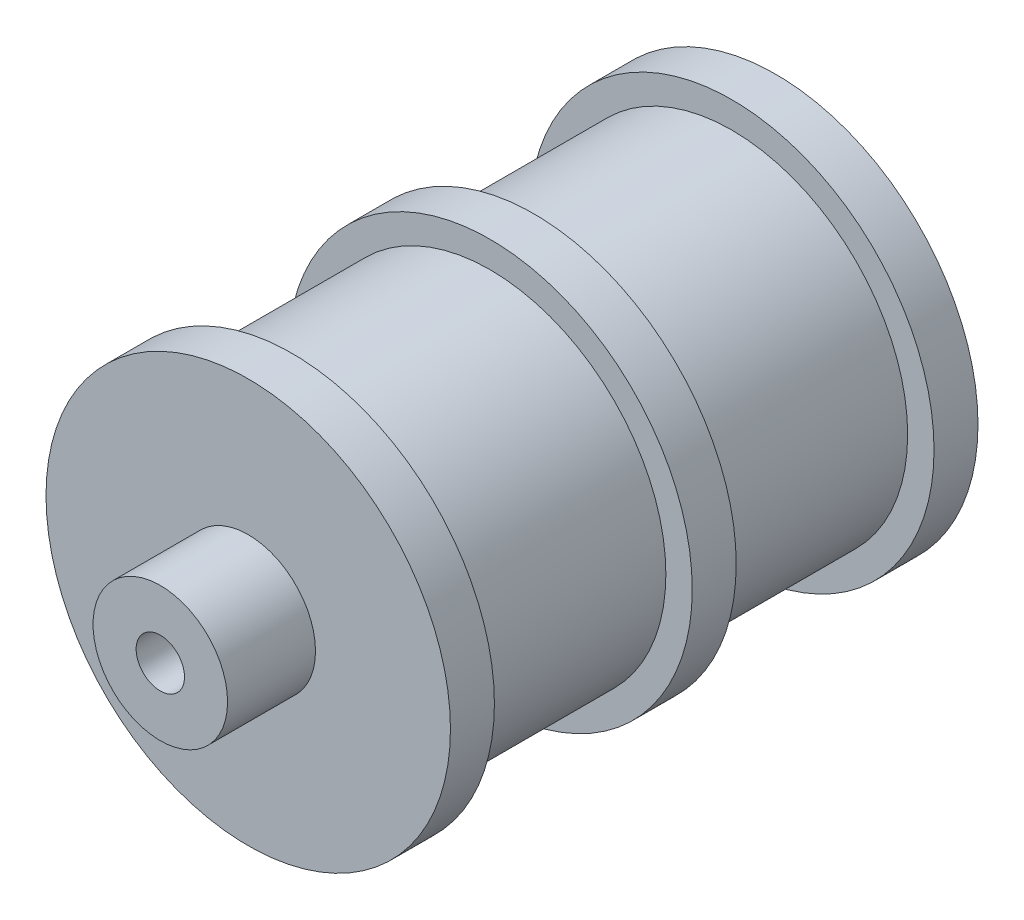
ISO-10303-21;
HEADER;
FILE_DESCRIPTION(('STEP AP214'),'2;1');
FILE_NAME('part.step','',(''),(''),'','','');
FILE_SCHEMA(('AUTOMOTIVE_DESIGN { 1 0 10303 214 1 1 1 1 }'));
ENDSEC;
DATA;
#1=APPLICATION_CONTEXT('core data for automotive mechanical design processes');
#2=APPLICATION_PROTOCOL_DEFINITION('international standard','automotive_design',2000,#1);
#3=PRODUCT_CONTEXT('',#1,'mechanical');
#4=PRODUCT('Part','Part','',(#3));
#5=PRODUCT_RELATED_PRODUCT_CATEGORY('part','',(#4));
#6=PRODUCT_DEFINITION_FORMATION('','',#4);
#7=PRODUCT_DEFINITION_CONTEXT('part definition',#1,'design');
#8=PRODUCT_DEFINITION('design','',#6,#7);
#9=PRODUCT_DEFINITION_SHAPE('','',#8);
#10=(LENGTH_UNIT() NAMED_UNIT(*) SI_UNIT(.MILLI.,.METRE.));
#11=(NAMED_UNIT(*) PLANE_ANGLE_UNIT() SI_UNIT($,.RADIAN.));
#12=(NAMED_UNIT(*) SI_UNIT($,.STERADIAN.) SOLID_ANGLE_UNIT());
#13=UNCERTAINTY_MEASURE_WITH_UNIT(LENGTH_MEASURE(1.E-05),#10,'distance_accuracy_value','');
#14=(GEOMETRIC_REPRESENTATION_CONTEXT(3) GLOBAL_UNCERTAINTY_ASSIGNED_CONTEXT((#13)) GLOBAL_UNIT_ASSIGNED_CONTEXT((#10,
#11,#12)) REPRESENTATION_CONTEXT('',''));
#15=CARTESIAN_POINT('',(0.,0.,0.));
#16=DIRECTION('',(0.,0.,1.));
#17=DIRECTION('',(1.,0.,0.));
#18=AXIS2_PLACEMENT_3D('',#15,#16,#17);
#19=CARTESIAN_POINT('',(0.,0.,40.));
#20=DIRECTION('',(0.,0.,1.));
#21=DIRECTION('',(1.,0.,0.));
#22=AXIS2_PLACEMENT_3D('',#19,#20,#21);
#23=PLANE('',#22);
#24=CARTESIAN_POINT('',(0.,0.,40.));
#25=DIRECTION('',(0.,0.,1.));
#26=DIRECTION('',(1.,0.,0.));
#27=AXIS2_PLACEMENT_3D('',#24,#25,#26);
#28=CIRCLE('',#27,7.65);
#29=CARTESIAN_POINT('',(7.65,0.,40.));
#30=VERTEX_POINT('',#29);
#31=EDGE_CURVE('E11',#30,#30,#28,.T.);
#32=ORIENTED_EDGE('',*,*,#31,.T.);
#33=EDGE_LOOP('',(#32));
#34=FACE_BOUND('',#33,.T.);
#35=CARTESIAN_POINT('',(0.,0.,40.));
#36=DIRECTION('',(0.,0.,1.));
#37=DIRECTION('',(1.,0.,0.));
#38=AXIS2_PLACEMENT_3D('',#35,#36,#37);
#39=CIRCLE('',#38,2.75);
#40=CARTESIAN_POINT('',(2.75,0.,40.));
#41=VERTEX_POINT('',#40);
#42=EDGE_CURVE('E54',#41,#41,#39,.T.);
#43=ORIENTED_EDGE('',*,*,#42,.F.);
#44=EDGE_LOOP('',(#43));
#45=FACE_BOUND('',#44,.T.);
#46=ADVANCED_FACE('F43',(#34,#45),#23,.T.);
#47=CARTESIAN_POINT('',(0.,0.,30.));
#48=DIRECTION('',(0.,0.,1.));
#49=DIRECTION('',(1.,0.,0.));
#50=AXIS2_PLACEMENT_3D('',#47,#48,#49);
#51=PLANE('',#50);
#52=CARTESIAN_POINT('',(0.,0.,30.));
#53=DIRECTION('',(0.,0.,1.));
#54=DIRECTION('',(1.,0.,0.));
#55=AXIS2_PLACEMENT_3D('',#52,#53,#54);
#56=CIRCLE('',#55,7.65);
#57=CARTESIAN_POINT('',(7.65,0.,30.));
#58=VERTEX_POINT('',#57);
#59=EDGE_CURVE('E47',#58,#58,#56,.T.);
#60=ORIENTED_EDGE('',*,*,#59,.F.);
#61=EDGE_LOOP('',(#60));
#62=FACE_BOUND('',#61,.T.);
#63=CARTESIAN_POINT('',(0.,0.,30.));
#64=DIRECTION('',(0.,0.,1.));
#65=DIRECTION('',(1.,0.,0.));
#66=AXIS2_PLACEMENT_3D('',#63,#64,#65);
#67=CIRCLE('',#66,2.75);
#68=CARTESIAN_POINT('',(2.75,0.,30.));
#69=VERTEX_POINT('',#68);
#70=EDGE_CURVE('E56',#69,#69,#67,.T.);
#71=ORIENTED_EDGE('',*,*,#70,.T.);
#72=EDGE_LOOP('',(#71));
#73=FACE_BOUND('',#72,.T.);
#74=ADVANCED_FACE('F66',(#62,#73),#51,.F.);
#75=CARTESIAN_POINT('',(0.,0.,40.));
#76=DIRECTION('',(0.,0.,-1.));
#77=DIRECTION('',(-1.,0.,0.));
#78=AXIS2_PLACEMENT_3D('',#75,#76,#77);
#79=CYLINDRICAL_SURFACE('',#78,7.65);
#80=ORIENTED_EDGE('',*,*,#31,.F.);
#81=EDGE_LOOP('',(#80));
#82=FACE_BOUND('',#81,.T.);
#83=ORIENTED_EDGE('',*,*,#59,.T.);
#84=EDGE_LOOP('',(#83));
#85=FACE_BOUND('',#84,.T.);
#86=ADVANCED_FACE('F45',(#82,#85),#79,.T.);
#87=CARTESIAN_POINT('',(0.,0.,40.));
#88=DIRECTION('',(0.,0.,-1.));
#89=DIRECTION('',(-1.,0.,0.));
#90=AXIS2_PLACEMENT_3D('',#87,#88,#89);
#91=CYLINDRICAL_SURFACE('',#90,2.75);
#92=ORIENTED_EDGE('',*,*,#42,.T.);
#93=EDGE_LOOP('',(#92));
#94=FACE_BOUND('',#93,.T.);
#95=ORIENTED_EDGE('',*,*,#70,.F.);
#96=EDGE_LOOP('',(#95));
#97=FACE_BOUND('',#96,.T.);
#98=ADVANCED_FACE('F62',(#94,#97),#91,.F.);
#99=CLOSED_SHELL('',(#46,#74,#86,#98));
#100=MANIFOLD_SOLID_BREP('B2',#99);
#101=CARTESIAN_POINT('',(0.,0.,-30.));
#102=DIRECTION('',(0.,0.,1.));
#103=DIRECTION('',(1.,0.,0.));
#104=AXIS2_PLACEMENT_3D('',#101,#102,#103);
#105=CYLINDRICAL_SURFACE('',#104,20.);
#106=CARTESIAN_POINT('',(0.,0.,-2.5));
#107=DIRECTION('',(0.,0.,1.));
#108=DIRECTION('',(1.,0.,0.));
#109=AXIS2_PLACEMENT_3D('',#106,#107,#108);
#110=CIRCLE('',#109,20.);
#111=CARTESIAN_POINT('',(20.,0.,-2.5));
#112=VERTEX_POINT('',#111);
#113=EDGE_CURVE('E122',#112,#112,#110,.T.);
#114=ORIENTED_EDGE('',*,*,#113,.F.);
#115=EDGE_LOOP('',(#114));
#116=FACE_BOUND('',#115,.T.);
#117=CARTESIAN_POINT('',(0.,0.,-25.));
#118=DIRECTION('',(0.,0.,-1.));
#119=DIRECTION('',(-1.,0.,0.));
#120=AXIS2_PLACEMENT_3D('',#117,#118,#119);
#121=CIRCLE('',#120,20.);
#122=CARTESIAN_POINT('',(-20.,0.,-25.));
#123=VERTEX_POINT('',#122);
#124=EDGE_CURVE('E109',#123,#123,#121,.F.);
#125=ORIENTED_EDGE('',*,*,#124,.T.);
#126=EDGE_LOOP('',(#125));
#127=FACE_BOUND('',#126,.T.);
#128=ADVANCED_FACE('F105',(#116,#127),#105,.T.);
#129=CARTESIAN_POINT('',(0.,0.,2.5));
#130=DIRECTION('',(0.,0.,1.));
#131=DIRECTION('',(1.,0.,0.));
#132=AXIS2_PLACEMENT_3D('',#129,#130,#131);
#133=CIRCLE('',#132,20.);
#134=CARTESIAN_POINT('',(20.,0.,2.5));
#135=VERTEX_POINT('',#134);
#136=EDGE_CURVE('E42',#135,#135,#133,.T.);
#137=ORIENTED_EDGE('',*,*,#136,.T.);
#138=EDGE_LOOP('',(#137));
#139=FACE_BOUND('',#138,.T.);
#140=CARTESIAN_POINT('',(0.,0.,25.));
#141=DIRECTION('',(0.,0.,1.));
#142=DIRECTION('',(1.,0.,0.));
#143=AXIS2_PLACEMENT_3D('',#140,#141,#142);
#144=CIRCLE('',#143,20.);
#145=CARTESIAN_POINT('',(20.,0.,25.));
#146=VERTEX_POINT('',#145);
#147=EDGE_CURVE('E129',#146,#146,#144,.T.);
#148=ORIENTED_EDGE('',*,*,#147,.F.);
#149=EDGE_LOOP('',(#148));
#150=FACE_BOUND('',#149,.T.);
#151=ADVANCED_FACE('F179',(#139,#150),#105,.T.);
#152=CARTESIAN_POINT('',(0.,0.,-2.5));
#153=DIRECTION('',(0.,0.,1.));
#154=DIRECTION('',(1.,0.,0.));
#155=AXIS2_PLACEMENT_3D('',#152,#153,#154);
#156=CYLINDRICAL_SURFACE('',#155,23.);
#157=CARTESIAN_POINT('',(0.,0.,-2.5));
#158=DIRECTION('',(0.,0.,1.));
#159=DIRECTION('',(1.,0.,0.));
#160=AXIS2_PLACEMENT_3D('',#157,#158,#159);
#161=CIRCLE('',#160,23.);
#162=CARTESIAN_POINT('',(23.,0.,-2.5));
#163=VERTEX_POINT('',#162);
#164=EDGE_CURVE('E113',#163,#163,#161,.T.);
#165=ORIENTED_EDGE('',*,*,#164,.T.);
#166=EDGE_LOOP('',(#165));
#167=FACE_BOUND('',#166,.T.);
#168=CARTESIAN_POINT('',(0.,0.,2.5));
#169=DIRECTION('',(0.,0.,1.));
#170=DIRECTION('',(1.,0.,0.));
#171=AXIS2_PLACEMENT_3D('',#168,#169,#170);
#172=CIRCLE('',#171,23.);
#173=CARTESIAN_POINT('',(23.,0.,2.5));
#174=VERTEX_POINT('',#173);
#175=EDGE_CURVE('E117',#174,#174,#172,.T.);
#176=ORIENTED_EDGE('',*,*,#175,.F.);
#177=EDGE_LOOP('',(#176));
#178=FACE_BOUND('',#177,.T.);
#179=ADVANCED_FACE('F107',(#167,#178),#156,.T.);
#180=CARTESIAN_POINT('',(0.,0.,-2.5));
#181=DIRECTION('',(0.,0.,1.));
#182=DIRECTION('',(1.,0.,0.));
#183=AXIS2_PLACEMENT_3D('',#180,#181,#182);
#184=PLANE('',#183);
#185=ORIENTED_EDGE('',*,*,#113,.T.);
#186=EDGE_LOOP('',(#185));
#187=FACE_BOUND('',#186,.T.);
#188=ORIENTED_EDGE('',*,*,#164,.F.);
#189=EDGE_LOOP('',(#188));
#190=FACE_BOUND('',#189,.T.);
#191=ADVANCED_FACE('F175',(#187,#190),#184,.F.);
#192=CARTESIAN_POINT('',(0.,0.,2.5));
#193=DIRECTION('',(0.,0.,1.));
#194=DIRECTION('',(1.,0.,0.));
#195=AXIS2_PLACEMENT_3D('',#192,#193,#194);
#196=PLANE('',#195);
#197=ORIENTED_EDGE('',*,*,#136,.F.);
#198=EDGE_LOOP('',(#197));
#199=FACE_BOUND('',#198,.T.);
#200=ORIENTED_EDGE('',*,*,#175,.T.);
#201=EDGE_LOOP('',(#200));
#202=FACE_BOUND('',#201,.T.);
#203=ADVANCED_FACE('F166',(#199,#202),#196,.T.);
#204=CARTESIAN_POINT('',(0.,0.,25.));
#205=DIRECTION('',(0.,0.,1.));
#206=DIRECTION('',(1.,0.,0.));
#207=AXIS2_PLACEMENT_3D('',#204,#205,#206);
#208=CYLINDRICAL_SURFACE('',#207,23.);
#209=CARTESIAN_POINT('',(0.,0.,25.));
#210=DIRECTION('',(0.,0.,1.));
#211=DIRECTION('',(1.,0.,0.));
#212=AXIS2_PLACEMENT_3D('',#209,#210,#211);
#213=CIRCLE('',#212,23.);
#214=CARTESIAN_POINT('',(23.,0.,25.));
#215=VERTEX_POINT('',#214);
#216=EDGE_CURVE('E125',#215,#215,#213,.T.);
#217=ORIENTED_EDGE('',*,*,#216,.T.);
#218=EDGE_LOOP('',(#217));
#219=FACE_BOUND('',#218,.T.);
#220=CARTESIAN_POINT('',(0.,0.,30.));
#221=DIRECTION('',(0.,0.,1.));
#222=DIRECTION('',(1.,0.,0.));
#223=AXIS2_PLACEMENT_3D('',#220,#221,#222);
#224=CIRCLE('',#223,23.);
#225=CARTESIAN_POINT('',(23.,0.,30.));
#226=VERTEX_POINT('',#225);
#227=EDGE_CURVE('E126',#226,#226,#224,.T.);
#228=ORIENTED_EDGE('',*,*,#227,.F.);
#229=EDGE_LOOP('',(#228));
#230=FACE_BOUND('',#229,.T.);
#231=ADVANCED_FACE('F164',(#219,#230),#208,.T.);
#232=CARTESIAN_POINT('',(0.,0.,25.));
#233=DIRECTION('',(0.,0.,1.));
#234=DIRECTION('',(1.,0.,0.));
#235=AXIS2_PLACEMENT_3D('',#232,#233,#234);
#236=PLANE('',#235);
#237=ORIENTED_EDGE('',*,*,#147,.T.);
#238=EDGE_LOOP('',(#237));
#239=FACE_BOUND('',#238,.T.);
#240=ORIENTED_EDGE('',*,*,#216,.F.);
#241=EDGE_LOOP('',(#240));
#242=FACE_BOUND('',#241,.T.);
#243=ADVANCED_FACE('F160',(#239,#242),#236,.F.);
#244=CARTESIAN_POINT('',(0.,0.,30.));
#245=DIRECTION('',(0.,0.,1.));
#246=DIRECTION('',(1.,0.,0.));
#247=AXIS2_PLACEMENT_3D('',#244,#245,#246);
#248=PLANE('',#247);
#249=CARTESIAN_POINT('',(0.,0.,30.));
#250=DIRECTION('',(0.,0.,1.));
#251=DIRECTION('',(1.,0.,0.));
#252=AXIS2_PLACEMENT_3D('',#249,#250,#251);
#253=CIRCLE('',#252,2.75);
#254=CARTESIAN_POINT('',(2.75,0.,30.));
#255=VERTEX_POINT('',#254);
#256=EDGE_CURVE('E141',#255,#255,#253,.T.);
#257=ORIENTED_EDGE('',*,*,#256,.F.);
#258=EDGE_LOOP('',(#257));
#259=FACE_BOUND('',#258,.T.);
#260=ORIENTED_EDGE('',*,*,#227,.T.);
#261=EDGE_LOOP('',(#260));
#262=FACE_BOUND('',#261,.T.);
#263=ADVANCED_FACE('F156',(#259,#262),#248,.T.);
#264=CARTESIAN_POINT('',(0.,0.,-25.));
#265=DIRECTION('',(0.,0.,-1.));
#266=DIRECTION('',(1.,0.,0.));
#267=AXIS2_PLACEMENT_3D('',#264,#265,#266);
#268=CYLINDRICAL_SURFACE('',#267,23.);
#269=CARTESIAN_POINT('',(0.,0.,-25.));
#270=DIRECTION('',(0.,0.,1.));
#271=DIRECTION('',(1.,0.,0.));
#272=AXIS2_PLACEMENT_3D('',#269,#270,#271);
#273=CIRCLE('',#272,23.);
#274=CARTESIAN_POINT('',(23.,0.,-25.));
#275=VERTEX_POINT('',#274);
#276=EDGE_CURVE('E134',#275,#275,#273,.T.);
#277=ORIENTED_EDGE('',*,*,#276,.F.);
#278=EDGE_LOOP('',(#277));
#279=FACE_BOUND('',#278,.T.);
#280=CARTESIAN_POINT('',(0.,0.,-30.));
#281=DIRECTION('',(0.,0.,1.));
#282=DIRECTION('',(1.,0.,0.));
#283=AXIS2_PLACEMENT_3D('',#280,#281,#282);
#284=CIRCLE('',#283,23.);
#285=CARTESIAN_POINT('',(23.,0.,-30.));
#286=VERTEX_POINT('',#285);
#287=EDGE_CURVE('E137',#286,#286,#284,.T.);
#288=ORIENTED_EDGE('',*,*,#287,.T.);
#289=EDGE_LOOP('',(#288));
#290=FACE_BOUND('',#289,.T.);
#291=ADVANCED_FACE('F159',(#279,#290),#268,.T.);
#292=CARTESIAN_POINT('',(0.,0.,-25.));
#293=DIRECTION('',(0.,0.,-1.));
#294=DIRECTION('',(1.,0.,0.));
#295=AXIS2_PLACEMENT_3D('',#292,#293,#294);
#296=PLANE('',#295);
#297=ORIENTED_EDGE('',*,*,#124,.F.);
#298=EDGE_LOOP('',(#297));
#299=FACE_BOUND('',#298,.T.);
#300=ORIENTED_EDGE('',*,*,#276,.T.);
#301=EDGE_LOOP('',(#300));
#302=FACE_BOUND('',#301,.T.);
#303=ADVANCED_FACE('F233',(#299,#302),#296,.F.);
#304=CARTESIAN_POINT('',(0.,0.,-30.));
#305=DIRECTION('',(0.,0.,1.));
#306=DIRECTION('',(1.,0.,0.));
#307=AXIS2_PLACEMENT_3D('',#304,#305,#306);
#308=PLANE('',#307);
#309=CARTESIAN_POINT('',(0.,0.,-30.));
#310=DIRECTION('',(0.,0.,1.));
#311=DIRECTION('',(1.,0.,0.));
#312=AXIS2_PLACEMENT_3D('',#309,#310,#311);
#313=CIRCLE('',#312,2.75);
#314=CARTESIAN_POINT('',(2.75,0.,-30.));
#315=VERTEX_POINT('',#314);
#316=EDGE_CURVE('E140',#315,#315,#313,.T.);
#317=ORIENTED_EDGE('',*,*,#316,.T.);
#318=EDGE_LOOP('',(#317));
#319=FACE_BOUND('',#318,.T.);
#320=ORIENTED_EDGE('',*,*,#287,.F.);
#321=EDGE_LOOP('',(#320));
#322=FACE_BOUND('',#321,.T.);
#323=ADVANCED_FACE('F147',(#319,#322),#308,.F.);
#324=CARTESIAN_POINT('',(0.,0.,-30.));
#325=DIRECTION('',(0.,0.,1.));
#326=DIRECTION('',(1.,0.,0.));
#327=AXIS2_PLACEMENT_3D('',#324,#325,#326);
#328=CYLINDRICAL_SURFACE('',#327,2.75);
#329=ORIENTED_EDGE('',*,*,#316,.F.);
#330=EDGE_LOOP('',(#329));
#331=FACE_BOUND('',#330,.T.);
#332=ORIENTED_EDGE('',*,*,#256,.T.);
#333=EDGE_LOOP('',(#332));
#334=FACE_BOUND('',#333,.T.);
#335=ADVANCED_FACE('F150',(#331,#334),#328,.F.);
#336=CLOSED_SHELL('',(#128,#151,#179,#191,#203,#231,#243,#263,#291,#303,#323,#335));
#337=MANIFOLD_SOLID_BREP('B6',#336);
#338=ADVANCED_BREP_SHAPE_REPRESENTATION('',(#18,#100,#337),#14);
#339=SHAPE_DEFINITION_REPRESENTATION(#9,#338);
ENDSEC;
END-ISO-10303-21;
